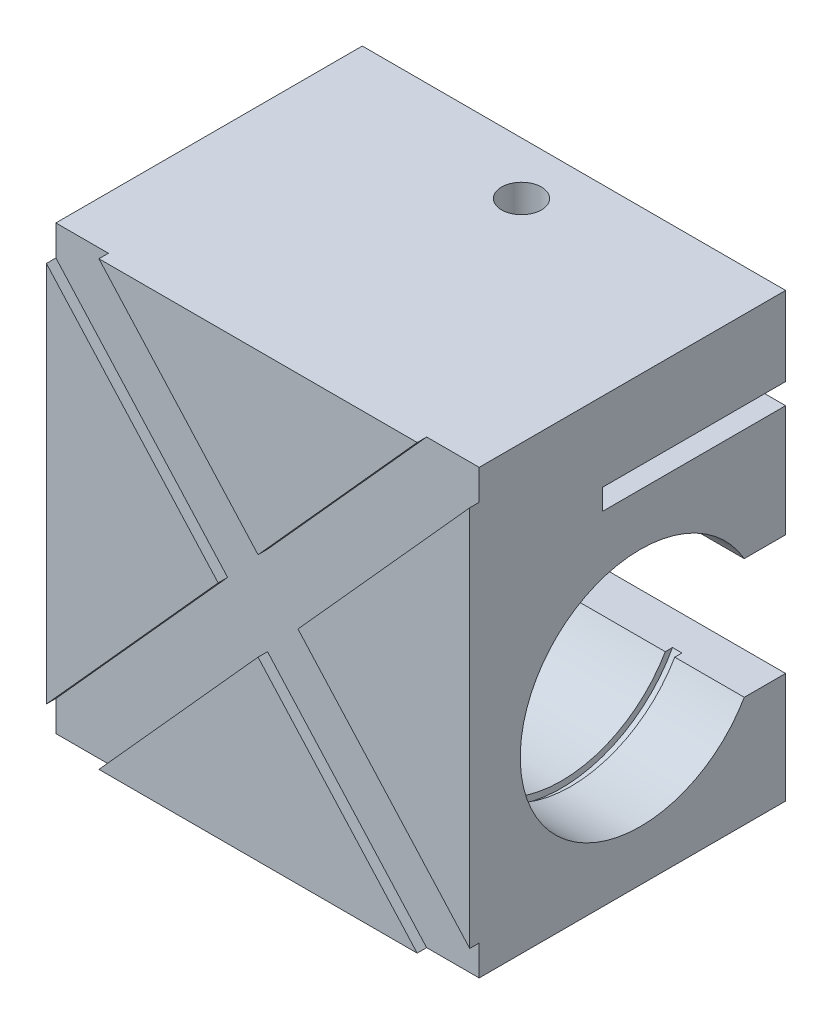
ISO-10303-21;
HEADER;
FILE_DESCRIPTION(('STEP AP214'),'2;1');
FILE_NAME('part.step','',(''),(''),'','','');
FILE_SCHEMA(('AUTOMOTIVE_DESIGN { 1 0 10303 214 1 1 1 1 }'));
ENDSEC;
DATA;
#1=APPLICATION_CONTEXT('core data for automotive mechanical design processes');
#2=APPLICATION_PROTOCOL_DEFINITION('international standard','automotive_design',2000,#1);
#3=PRODUCT_CONTEXT('',#1,'mechanical');
#4=PRODUCT('Part','Part','',(#3));
#5=PRODUCT_RELATED_PRODUCT_CATEGORY('part','',(#4));
#6=PRODUCT_DEFINITION_FORMATION('','',#4);
#7=PRODUCT_DEFINITION_CONTEXT('part definition',#1,'design');
#8=PRODUCT_DEFINITION('design','',#6,#7);
#9=PRODUCT_DEFINITION_SHAPE('','',#8);
#10=(LENGTH_UNIT() NAMED_UNIT(*) SI_UNIT(.MILLI.,.METRE.));
#11=(NAMED_UNIT(*) PLANE_ANGLE_UNIT() SI_UNIT($,.RADIAN.));
#12=(NAMED_UNIT(*) SI_UNIT($,.STERADIAN.) SOLID_ANGLE_UNIT());
#13=UNCERTAINTY_MEASURE_WITH_UNIT(LENGTH_MEASURE(1.E-05),#10,'distance_accuracy_value','');
#14=(GEOMETRIC_REPRESENTATION_CONTEXT(3) GLOBAL_UNCERTAINTY_ASSIGNED_CONTEXT((#13)) GLOBAL_UNIT_ASSIGNED_CONTEXT((#10,
#11,#12)) REPRESENTATION_CONTEXT('',''));
#15=CARTESIAN_POINT('',(0.,0.,0.));
#16=DIRECTION('',(0.,0.,1.));
#17=DIRECTION('',(1.,0.,0.));
#18=AXIS2_PLACEMENT_3D('',#15,#16,#17);
#19=CARTESIAN_POINT('',(-33.5,70.,25.));
#20=DIRECTION('',(0.,0.,-1.));
#21=DIRECTION('',(-1.,0.,0.));
#22=AXIS2_PLACEMENT_3D('',#19,#20,#21);
#23=PLANE('',#22);
#24=DIRECTION('',(0.,-1.,0.));
#25=VECTOR('',#24,1.);
#26=CARTESIAN_POINT('',(-33.5,70.,25.));
#27=LINE('',#26,#25);
#28=CARTESIAN_POINT('',(-33.5,65.2,25.));
#29=VERTEX_POINT('',#28);
#30=CARTESIAN_POINT('',(-33.5,4.8,25.));
#31=VERTEX_POINT('',#30);
#32=EDGE_CURVE('E398',#29,#31,#27,.T.);
#33=ORIENTED_EDGE('',*,*,#32,.T.);
#34=DIRECTION('',(-0.669003503005515,-0.743259250172071,0.));
#35=VECTOR('',#34,1.);
#36=CARTESIAN_POINT('',(-33.5,4.8,25.));
#37=LINE('',#36,#35);
#38=CARTESIAN_POINT('',(-6.31714854394455,35.,25.));
#39=VERTEX_POINT('',#38);
#40=EDGE_CURVE('E264',#39,#31,#37,.T.);
#41=ORIENTED_EDGE('',*,*,#40,.F.);
#42=DIRECTION('',(0.669003503005515,-0.743259250172071,0.));
#43=VECTOR('',#42,1.);
#44=CARTESIAN_POINT('',(-33.5,65.2,25.));
#45=LINE('',#44,#43);
#46=EDGE_CURVE('E472',#29,#39,#45,.T.);
#47=ORIENTED_EDGE('',*,*,#46,.F.);
#48=EDGE_LOOP('',(#33,#41,#47));
#49=FACE_BOUND('',#48,.T.);
#50=ADVANCED_FACE('F39',(#49),#23,.F.);
#51=DIRECTION('',(1.,0.,0.));
#52=VECTOR('',#51,1.);
#53=CARTESIAN_POINT('',(-33.5,70.,25.));
#54=LINE('',#53,#52);
#55=CARTESIAN_POINT('',(-25.1861561236694,70.,25.));
#56=VERTEX_POINT('',#55);
#57=CARTESIAN_POINT('',(25.1861561236694,70.,25.));
#58=VERTEX_POINT('',#57);
#59=EDGE_CURVE('E385',#56,#58,#54,.T.);
#60=ORIENTED_EDGE('',*,*,#59,.F.);
#61=DIRECTION('',(-0.669003503005515,0.743259250172071,0.));
#62=VECTOR('',#61,1.);
#63=CARTESIAN_POINT('',(-25.1861561236694,70.,25.));
#64=LINE('',#63,#62);
#65=CARTESIAN_POINT('',(0.,42.0183176454296,25.));
#66=VERTEX_POINT('',#65);
#67=EDGE_CURVE('E474',#66,#56,#64,.T.);
#68=ORIENTED_EDGE('',*,*,#67,.F.);
#69=DIRECTION('',(-0.669003503005515,-0.743259250172071,0.));
#70=VECTOR('',#69,1.);
#71=CARTESIAN_POINT('',(0.,42.0183176454296,25.));
#72=LINE('',#71,#70);
#73=EDGE_CURVE('E477',#58,#66,#72,.T.);
#74=ORIENTED_EDGE('',*,*,#73,.F.);
#75=EDGE_LOOP('',(#60,#68,#74));
#76=FACE_BOUND('',#75,.T.);
#77=ADVANCED_FACE('F521',(#76),#23,.F.);
#78=DIRECTION('',(0.,-1.,0.));
#79=VECTOR('',#78,1.);
#80=CARTESIAN_POINT('',(33.5,70.,25.));
#81=LINE('',#80,#79);
#82=CARTESIAN_POINT('',(33.5,65.1999999999996,25.));
#83=VERTEX_POINT('',#82);
#84=CARTESIAN_POINT('',(33.5,4.80000000000044,25.));
#85=VERTEX_POINT('',#84);
#86=EDGE_CURVE('E388',#83,#85,#81,.T.);
#87=ORIENTED_EDGE('',*,*,#86,.F.);
#88=DIRECTION('',(0.669003503006094,0.74325925017155,0.));
#89=VECTOR('',#88,1.);
#90=CARTESIAN_POINT('',(6.31714854391234,35.0000000000111,25.));
#91=LINE('',#90,#89);
#92=CARTESIAN_POINT('',(6.31714854391234,35.0000000000111,25.));
#93=VERTEX_POINT('',#92);
#94=EDGE_CURVE('E511',#93,#83,#91,.T.);
#95=ORIENTED_EDGE('',*,*,#94,.F.);
#96=DIRECTION('',(-0.669003503005822,0.743259250171795,0.));
#97=VECTOR('',#96,1.);
#98=CARTESIAN_POINT('',(6.31714854391234,35.0000000000111,25.));
#99=LINE('',#98,#97);
#100=EDGE_CURVE('E505',#85,#93,#99,.T.);
#101=ORIENTED_EDGE('',*,*,#100,.F.);
#102=EDGE_LOOP('',(#87,#95,#101));
#103=FACE_BOUND('',#102,.T.);
#104=ADVANCED_FACE('F580',(#103),#23,.F.);
#105=CARTESIAN_POINT('',(-90.1392090340252,27.,-1.99999999999999));
#106=DIRECTION('',(1.,0.,0.));
#107=DIRECTION('',(0.,0.,-1.));
#108=AXIS2_PLACEMENT_3D('',#105,#106,#107);
#109=CYLINDRICAL_SURFACE('',#108,19.);
#110=CARTESIAN_POINT('',(-22.5,27.,-1.99999999999999));
#111=DIRECTION('',(1.,0.,0.));
#112=DIRECTION('',(0.,0.,-1.));
#113=AXIS2_PLACEMENT_3D('',#110,#111,#112);
#114=CIRCLE('',#113,19.);
#115=CARTESIAN_POINT('',(-22.5,17.5,-18.4544826719043));
#116=VERTEX_POINT('',#115);
#117=CARTESIAN_POINT('',(-22.5,36.5,-18.4544826719043));
#118=VERTEX_POINT('',#117);
#119=EDGE_CURVE('E294',#116,#118,#114,.F.);
#120=ORIENTED_EDGE('',*,*,#119,.F.);
#121=DIRECTION('',(1.,0.,0.));
#122=VECTOR('',#121,1.);
#123=CARTESIAN_POINT('',(-90.1392090340252,17.5,-18.4544826719043));
#124=LINE('',#123,#122);
#125=CARTESIAN_POINT('',(-33.5,17.5,-18.4544826719043));
#126=VERTEX_POINT('',#125);
#127=EDGE_CURVE('E348',#126,#116,#124,.T.);
#128=ORIENTED_EDGE('',*,*,#127,.F.);
#129=CARTESIAN_POINT('',(-33.5,27.,-1.99999999999999));
#130=DIRECTION('',(1.,0.,0.));
#131=DIRECTION('',(0.,0.,-1.));
#132=AXIS2_PLACEMENT_3D('',#129,#130,#131);
#133=CIRCLE('',#132,19.);
#134=CARTESIAN_POINT('',(-33.5,36.5,-18.4544826719043));
#135=VERTEX_POINT('',#134);
#136=EDGE_CURVE('E322',#126,#135,#133,.F.);
#137=ORIENTED_EDGE('',*,*,#136,.T.);
#138=DIRECTION('',(1.,0.,0.));
#139=VECTOR('',#138,1.);
#140=CARTESIAN_POINT('',(-90.1392090340252,36.5,-18.4544826719043));
#141=LINE('',#140,#139);
#142=EDGE_CURVE('E343',#135,#118,#141,.T.);
#143=ORIENTED_EDGE('',*,*,#142,.T.);
#144=EDGE_LOOP('',(#120,#128,#137,#143));
#145=FACE_BOUND('',#144,.T.);
#146=ADVANCED_FACE('F438',(#145),#109,.F.);
#147=CARTESIAN_POINT('',(-90.1392090340252,17.5,-25.));
#148=DIRECTION('',(0.,1.,0.));
#149=DIRECTION('',(0.,0.,1.));
#150=AXIS2_PLACEMENT_3D('',#147,#148,#149);
#151=PLANE('',#150);
#152=ORIENTED_EDGE('',*,*,#127,.T.);
#153=DIRECTION('',(0.,0.,-1.));
#154=VECTOR('',#153,1.);
#155=CARTESIAN_POINT('',(-22.5,17.5,-25.));
#156=LINE('',#155,#154);
#157=CARTESIAN_POINT('',(-22.5,17.5,-19.599715906798));
#158=VERTEX_POINT('',#157);
#159=EDGE_CURVE('E296',#116,#158,#156,.T.);
#160=ORIENTED_EDGE('',*,*,#159,.T.);
#161=DIRECTION('',(1.,0.,0.));
#162=VECTOR('',#161,1.);
#163=CARTESIAN_POINT('',(-22.5,17.5,-19.599715906798));
#164=LINE('',#163,#162);
#165=CARTESIAN_POINT('',(-21.,17.5,-19.599715906798));
#166=VERTEX_POINT('',#165);
#167=EDGE_CURVE('E299',#166,#158,#164,.F.);
#168=ORIENTED_EDGE('',*,*,#167,.F.);
#169=DIRECTION('',(0.,0.,-1.));
#170=VECTOR('',#169,1.);
#171=CARTESIAN_POINT('',(-21.,17.5,-25.));
#172=LINE('',#171,#170);
#173=CARTESIAN_POINT('',(-21.,17.5,-18.4544826719043));
#174=VERTEX_POINT('',#173);
#175=EDGE_CURVE('E292',#174,#166,#172,.T.);
#176=ORIENTED_EDGE('',*,*,#175,.F.);
#177=CARTESIAN_POINT('',(21.,17.5,-18.4544826719043));
#178=VERTEX_POINT('',#177);
#179=EDGE_CURVE('E351',#174,#178,#124,.T.);
#180=ORIENTED_EDGE('',*,*,#179,.T.);
#181=DIRECTION('',(0.,0.,-1.));
#182=VECTOR('',#181,1.);
#183=CARTESIAN_POINT('',(21.,17.5,-25.));
#184=LINE('',#183,#182);
#185=CARTESIAN_POINT('',(21.,17.5,-19.599715906798));
#186=VERTEX_POINT('',#185);
#187=EDGE_CURVE('E310',#178,#186,#184,.T.);
#188=ORIENTED_EDGE('',*,*,#187,.T.);
#189=DIRECTION('',(-1.,0.,0.));
#190=VECTOR('',#189,1.);
#191=CARTESIAN_POINT('',(22.5,17.5,-19.599715906798));
#192=LINE('',#191,#190);
#193=CARTESIAN_POINT('',(22.5,17.5,-19.599715906798));
#194=VERTEX_POINT('',#193);
#195=EDGE_CURVE('E318',#186,#194,#192,.F.);
#196=ORIENTED_EDGE('',*,*,#195,.T.);
#197=DIRECTION('',(0.,0.,-1.));
#198=VECTOR('',#197,1.);
#199=CARTESIAN_POINT('',(22.5,17.5,-25.));
#200=LINE('',#199,#198);
#201=CARTESIAN_POINT('',(22.5,17.5,-18.4544826719043));
#202=VERTEX_POINT('',#201);
#203=EDGE_CURVE('E316',#202,#194,#200,.T.);
#204=ORIENTED_EDGE('',*,*,#203,.F.);
#205=CARTESIAN_POINT('',(33.5,17.5,-18.4544826719043));
#206=VERTEX_POINT('',#205);
#207=EDGE_CURVE('E346',#202,#206,#124,.T.);
#208=ORIENTED_EDGE('',*,*,#207,.T.);
#209=DIRECTION('',(0.,0.,1.));
#210=VECTOR('',#209,1.);
#211=CARTESIAN_POINT('',(33.5,17.5,-25.));
#212=LINE('',#211,#210);
#213=CARTESIAN_POINT('',(33.5,17.5,-25.));
#214=VERTEX_POINT('',#213);
#215=EDGE_CURVE('E330',#214,#206,#212,.T.);
#216=ORIENTED_EDGE('',*,*,#215,.F.);
#217=DIRECTION('',(1.,0.,0.));
#218=VECTOR('',#217,1.);
#219=CARTESIAN_POINT('',(-90.1392090340252,17.5,-25.));
#220=LINE('',#219,#218);
#221=CARTESIAN_POINT('',(-33.5,17.5,-25.));
#222=VERTEX_POINT('',#221);
#223=EDGE_CURVE('E326',#222,#214,#220,.T.);
#224=ORIENTED_EDGE('',*,*,#223,.F.);
#225=DIRECTION('',(0.,0.,-1.));
#226=VECTOR('',#225,1.);
#227=CARTESIAN_POINT('',(-33.5,17.5,-25.));
#228=LINE('',#227,#226);
#229=EDGE_CURVE('E325',#126,#222,#228,.T.);
#230=ORIENTED_EDGE('',*,*,#229,.F.);
#231=EDGE_LOOP('',(#152,#160,#168,#176,#180,#188,#196,#204,#208,#216,#224,#230));
#232=FACE_BOUND('',#231,.T.);
#233=ADVANCED_FACE('F433',(#232),#151,.T.);
#234=CARTESIAN_POINT('',(-90.1392090340252,36.5,-25.));
#235=DIRECTION('',(0.,1.,0.));
#236=DIRECTION('',(0.,0.,1.));
#237=AXIS2_PLACEMENT_3D('',#234,#235,#236);
#238=PLANE('',#237);
#239=DIRECTION('',(0.,0.,-1.));
#240=VECTOR('',#239,1.);
#241=CARTESIAN_POINT('',(-22.5,36.5,-25.));
#242=LINE('',#241,#240);
#243=CARTESIAN_POINT('',(-22.5,36.5,-19.599715906798));
#244=VERTEX_POINT('',#243);
#245=EDGE_CURVE('E11',#118,#244,#242,.T.);
#246=ORIENTED_EDGE('',*,*,#245,.F.);
#247=ORIENTED_EDGE('',*,*,#142,.F.);
#248=DIRECTION('',(0.,0.,-1.));
#249=VECTOR('',#248,1.);
#250=CARTESIAN_POINT('',(-33.5,36.5,-25.));
#251=LINE('',#250,#249);
#252=CARTESIAN_POINT('',(-33.5,36.5,-25.));
#253=VERTEX_POINT('',#252);
#254=EDGE_CURVE('E329',#135,#253,#251,.T.);
#255=ORIENTED_EDGE('',*,*,#254,.T.);
#256=DIRECTION('',(1.,0.,0.));
#257=VECTOR('',#256,1.);
#258=CARTESIAN_POINT('',(-90.1392090340252,36.5,-25.));
#259=LINE('',#258,#257);
#260=CARTESIAN_POINT('',(33.5,36.5,-25.));
#261=VERTEX_POINT('',#260);
#262=EDGE_CURVE('E340',#253,#261,#259,.T.);
#263=ORIENTED_EDGE('',*,*,#262,.T.);
#264=DIRECTION('',(0.,0.,1.));
#265=VECTOR('',#264,1.);
#266=CARTESIAN_POINT('',(33.5,36.5,-25.));
#267=LINE('',#266,#265);
#268=CARTESIAN_POINT('',(33.5,36.5,-18.4544826719043));
#269=VERTEX_POINT('',#268);
#270=EDGE_CURVE('E337',#261,#269,#267,.T.);
#271=ORIENTED_EDGE('',*,*,#270,.T.);
#272=CARTESIAN_POINT('',(22.5,36.5,-18.4544826719043));
#273=VERTEX_POINT('',#272);
#274=EDGE_CURVE('E342',#273,#269,#141,.T.);
#275=ORIENTED_EDGE('',*,*,#274,.F.);
#276=DIRECTION('',(0.,0.,-1.));
#277=VECTOR('',#276,1.);
#278=CARTESIAN_POINT('',(22.5,36.5,-25.));
#279=LINE('',#278,#277);
#280=CARTESIAN_POINT('',(22.5,36.5,-19.599715906798));
#281=VERTEX_POINT('',#280);
#282=EDGE_CURVE('E415',#273,#281,#279,.T.);
#283=ORIENTED_EDGE('',*,*,#282,.T.);
#284=DIRECTION('',(-1.,0.,0.));
#285=VECTOR('',#284,1.);
#286=CARTESIAN_POINT('',(22.5,36.5,-19.599715906798));
#287=LINE('',#286,#285);
#288=CARTESIAN_POINT('',(21.,36.5,-19.599715906798));
#289=VERTEX_POINT('',#288);
#290=EDGE_CURVE('E413',#289,#281,#287,.F.);
#291=ORIENTED_EDGE('',*,*,#290,.F.);
#292=DIRECTION('',(0.,0.,-1.));
#293=VECTOR('',#292,1.);
#294=CARTESIAN_POINT('',(21.,36.5,-25.));
#295=LINE('',#294,#293);
#296=CARTESIAN_POINT('',(21.,36.5,-18.4544826719043));
#297=VERTEX_POINT('',#296);
#298=EDGE_CURVE('E410',#297,#289,#295,.T.);
#299=ORIENTED_EDGE('',*,*,#298,.F.);
#300=CARTESIAN_POINT('',(-21.,36.5,-18.4544826719043));
#301=VERTEX_POINT('',#300);
#302=EDGE_CURVE('E347',#301,#297,#141,.T.);
#303=ORIENTED_EDGE('',*,*,#302,.F.);
#304=DIRECTION('',(0.,0.,-1.));
#305=VECTOR('',#304,1.);
#306=CARTESIAN_POINT('',(-21.,36.5,-25.));
#307=LINE('',#306,#305);
#308=CARTESIAN_POINT('',(-21.,36.5,-19.599715906798));
#309=VERTEX_POINT('',#308);
#310=EDGE_CURVE('E418',#301,#309,#307,.T.);
#311=ORIENTED_EDGE('',*,*,#310,.T.);
#312=DIRECTION('',(1.,0.,0.));
#313=VECTOR('',#312,1.);
#314=CARTESIAN_POINT('',(-22.5,36.5,-19.599715906798));
#315=LINE('',#314,#313);
#316=EDGE_CURVE('E47',#309,#244,#315,.F.);
#317=ORIENTED_EDGE('',*,*,#316,.T.);
#318=EDGE_LOOP('',(#246,#247,#255,#263,#271,#275,#283,#291,#299,#303,#311,#317));
#319=FACE_BOUND('',#318,.T.);
#320=ADVANCED_FACE('F423',(#319),#238,.F.);
#321=ORIENTED_EDGE('',*,*,#179,.F.);
#322=CARTESIAN_POINT('',(-21.,27.,-1.99999999999999));
#323=DIRECTION('',(1.,0.,0.));
#324=DIRECTION('',(0.,0.,-1.));
#325=AXIS2_PLACEMENT_3D('',#322,#323,#324);
#326=CIRCLE('',#325,19.);
#327=EDGE_CURVE('E288',#174,#301,#326,.F.);
#328=ORIENTED_EDGE('',*,*,#327,.T.);
#329=ORIENTED_EDGE('',*,*,#302,.T.);
#330=CARTESIAN_POINT('',(21.,27.,-1.99999999999999));
#331=DIRECTION('',(1.,0.,0.));
#332=DIRECTION('',(0.,0.,-1.));
#333=AXIS2_PLACEMENT_3D('',#330,#331,#332);
#334=CIRCLE('',#333,19.);
#335=EDGE_CURVE('E305',#178,#297,#334,.F.);
#336=ORIENTED_EDGE('',*,*,#335,.F.);
#337=EDGE_LOOP('',(#321,#328,#329,#336));
#338=FACE_BOUND('',#337,.T.);
#339=ADVANCED_FACE('F596',(#338),#109,.F.);
#340=CARTESIAN_POINT('',(33.5,70.,-25.));
#341=DIRECTION('',(-1.,0.,0.));
#342=DIRECTION('',(0.,0.,1.));
#343=AXIS2_PLACEMENT_3D('',#340,#341,#342);
#344=PLANE('',#343);
#345=ORIENTED_EDGE('',*,*,#86,.T.);
#346=DIRECTION('',(0.,0.,1.));
#347=VECTOR('',#346,1.);
#348=CARTESIAN_POINT('',(33.5,4.80000000000044,23.5));
#349=LINE('',#348,#347);
#350=CARTESIAN_POINT('',(33.5,4.80000000000044,23.5));
#351=VERTEX_POINT('',#350);
#352=EDGE_CURVE('E496',#351,#85,#349,.T.);
#353=ORIENTED_EDGE('',*,*,#352,.F.);
#354=DIRECTION('',(0.,1.,0.));
#355=VECTOR('',#354,1.);
#356=CARTESIAN_POINT('',(33.5,4.44089209850063E-13,23.5));
#357=LINE('',#356,#355);
#358=CARTESIAN_POINT('',(33.5,4.44089209850063E-13,23.5));
#359=VERTEX_POINT('',#358);
#360=EDGE_CURVE('E618',#359,#351,#357,.T.);
#361=ORIENTED_EDGE('',*,*,#360,.F.);
#362=DIRECTION('',(0.,0.,-1.));
#363=VECTOR('',#362,1.);
#364=CARTESIAN_POINT('',(33.5,0.,-25.));
#365=LINE('',#364,#363);
#366=CARTESIAN_POINT('',(33.5,0.,-25.));
#367=VERTEX_POINT('',#366);
#368=EDGE_CURVE('E355',#359,#367,#365,.T.);
#369=ORIENTED_EDGE('',*,*,#368,.T.);
#370=DIRECTION('',(0.,-1.,0.));
#371=VECTOR('',#370,1.);
#372=CARTESIAN_POINT('',(33.5,70.,-25.));
#373=LINE('',#372,#371);
#374=EDGE_CURVE('E405',#214,#367,#373,.T.);
#375=ORIENTED_EDGE('',*,*,#374,.F.);
#376=ORIENTED_EDGE('',*,*,#215,.T.);
#377=CARTESIAN_POINT('',(33.5,27.,-1.99999999999999));
#378=DIRECTION('',(1.,0.,0.));
#379=DIRECTION('',(0.,0.,-1.));
#380=AXIS2_PLACEMENT_3D('',#377,#378,#379);
#381=CIRCLE('',#380,19.);
#382=EDGE_CURVE('E333',#269,#206,#381,.T.);
#383=ORIENTED_EDGE('',*,*,#382,.F.);
#384=ORIENTED_EDGE('',*,*,#270,.F.);
#385=CARTESIAN_POINT('',(33.5,54.2,-25.));
#386=VERTEX_POINT('',#385);
#387=EDGE_CURVE('E411',#386,#261,#373,.T.);
#388=ORIENTED_EDGE('',*,*,#387,.F.);
#389=DIRECTION('',(0.,0.,-1.));
#390=VECTOR('',#389,1.);
#391=CARTESIAN_POINT('',(33.5,54.2,4.));
#392=LINE('',#391,#390);
#393=CARTESIAN_POINT('',(33.5,54.2,4.));
#394=VERTEX_POINT('',#393);
#395=EDGE_CURVE('E334',#394,#386,#392,.T.);
#396=ORIENTED_EDGE('',*,*,#395,.F.);
#397=DIRECTION('',(0.,-1.,0.));
#398=VECTOR('',#397,1.);
#399=CARTESIAN_POINT('',(33.5,57.5,4.));
#400=LINE('',#399,#398);
#401=CARTESIAN_POINT('',(33.5,57.5,4.));
#402=VERTEX_POINT('',#401);
#403=EDGE_CURVE('E359',#402,#394,#400,.T.);
#404=ORIENTED_EDGE('',*,*,#403,.F.);
#405=DIRECTION('',(0.,0.,1.));
#406=VECTOR('',#405,1.);
#407=CARTESIAN_POINT('',(33.5,57.5,-25.));
#408=LINE('',#407,#406);
#409=CARTESIAN_POINT('',(33.5,57.5,-25.));
#410=VERTEX_POINT('',#409);
#411=EDGE_CURVE('E369',#410,#402,#408,.T.);
#412=ORIENTED_EDGE('',*,*,#411,.F.);
#413=CARTESIAN_POINT('',(33.5,70.,-25.));
#414=VERTEX_POINT('',#413);
#415=EDGE_CURVE('E407',#414,#410,#373,.T.);
#416=ORIENTED_EDGE('',*,*,#415,.F.);
#417=DIRECTION('',(0.,0.,-1.));
#418=VECTOR('',#417,1.);
#419=CARTESIAN_POINT('',(33.5,70.,-25.));
#420=LINE('',#419,#418);
#421=CARTESIAN_POINT('',(33.5,69.9999999999996,23.5));
#422=VERTEX_POINT('',#421);
#423=EDGE_CURVE('E378',#422,#414,#420,.T.);
#424=ORIENTED_EDGE('',*,*,#423,.F.);
#425=DIRECTION('',(0.,1.,0.));
#426=VECTOR('',#425,1.);
#427=CARTESIAN_POINT('',(33.5,69.9999999999996,23.5));
#428=LINE('',#427,#426);
#429=CARTESIAN_POINT('',(33.5,65.1999999999996,23.5));
#430=VERTEX_POINT('',#429);
#431=EDGE_CURVE('E604',#430,#422,#428,.T.);
#432=ORIENTED_EDGE('',*,*,#431,.F.);
#433=DIRECTION('',(0.,0.,1.));
#434=VECTOR('',#433,1.);
#435=CARTESIAN_POINT('',(33.5,65.1999999999996,23.5));
#436=LINE('',#435,#434);
#437=EDGE_CURVE('E491',#430,#83,#436,.T.);
#438=ORIENTED_EDGE('',*,*,#437,.T.);
#439=EDGE_LOOP('',(#345,#353,#361,#369,#375,#376,#383,#384,#388,#396,#404,#412,#416,#424,#432,#438));
#440=FACE_BOUND('',#439,.T.);
#441=ADVANCED_FACE('F41',(#440),#344,.F.);
#442=CARTESIAN_POINT('',(-33.5,70.,-25.));
#443=DIRECTION('',(0.,0.,1.));
#444=DIRECTION('',(1.,0.,0.));
#445=AXIS2_PLACEMENT_3D('',#442,#443,#444);
#446=PLANE('',#445);
#447=ORIENTED_EDGE('',*,*,#223,.T.);
#448=ORIENTED_EDGE('',*,*,#374,.T.);
#449=DIRECTION('',(-1.,0.,0.));
#450=VECTOR('',#449,1.);
#451=CARTESIAN_POINT('',(-33.5,0.,-25.));
#452=LINE('',#451,#450);
#453=CARTESIAN_POINT('',(-33.5,0.,-25.));
#454=VERTEX_POINT('',#453);
#455=EDGE_CURVE('E390',#367,#454,#452,.T.);
#456=ORIENTED_EDGE('',*,*,#455,.T.);
#457=DIRECTION('',(0.,-1.,0.));
#458=VECTOR('',#457,1.);
#459=CARTESIAN_POINT('',(-33.5,70.,-25.));
#460=LINE('',#459,#458);
#461=EDGE_CURVE('E401',#222,#454,#460,.T.);
#462=ORIENTED_EDGE('',*,*,#461,.F.);
#463=EDGE_LOOP('',(#447,#448,#456,#462));
#464=FACE_BOUND('',#463,.T.);
#465=ADVANCED_FACE('F459',(#464),#446,.F.);
#466=ORIENTED_EDGE('',*,*,#387,.T.);
#467=ORIENTED_EDGE('',*,*,#262,.F.);
#468=CARTESIAN_POINT('',(-33.5,54.2,-25.));
#469=VERTEX_POINT('',#468);
#470=EDGE_CURVE('E406',#469,#253,#460,.T.);
#471=ORIENTED_EDGE('',*,*,#470,.F.);
#472=DIRECTION('',(1.,0.,0.));
#473=VECTOR('',#472,1.);
#474=CARTESIAN_POINT('',(-90.1392090340252,54.2,-25.));
#475=LINE('',#474,#473);
#476=EDGE_CURVE('E356',#469,#386,#475,.T.);
#477=ORIENTED_EDGE('',*,*,#476,.T.);
#478=EDGE_LOOP('',(#466,#467,#471,#477));
#479=FACE_BOUND('',#478,.T.);
#480=ADVANCED_FACE('F451',(#479),#446,.F.);
#481=CARTESIAN_POINT('',(-33.5,70.,-25.));
#482=DIRECTION('',(1.,0.,0.));
#483=DIRECTION('',(0.,0.,-1.));
#484=AXIS2_PLACEMENT_3D('',#481,#482,#483);
#485=PLANE('',#484);
#486=ORIENTED_EDGE('',*,*,#32,.F.);
#487=DIRECTION('',(0.,0.,1.));
#488=VECTOR('',#487,1.);
#489=CARTESIAN_POINT('',(-33.5,65.2,23.5));
#490=LINE('',#489,#488);
#491=CARTESIAN_POINT('',(-33.5,65.2,23.5));
#492=VERTEX_POINT('',#491);
#493=EDGE_CURVE('E482',#492,#29,#490,.T.);
#494=ORIENTED_EDGE('',*,*,#493,.F.);
#495=DIRECTION('',(0.,-1.,0.));
#496=VECTOR('',#495,1.);
#497=CARTESIAN_POINT('',(-33.5,70.,23.5));
#498=LINE('',#497,#496);
#499=CARTESIAN_POINT('',(-33.5,70.,23.5));
#500=VERTEX_POINT('',#499);
#501=EDGE_CURVE('E533',#500,#492,#498,.T.);
#502=ORIENTED_EDGE('',*,*,#501,.F.);
#503=DIRECTION('',(0.,0.,1.));
#504=VECTOR('',#503,1.);
#505=CARTESIAN_POINT('',(-33.5,70.,-25.));
#506=LINE('',#505,#504);
#507=CARTESIAN_POINT('',(-33.5,70.,-25.));
#508=VERTEX_POINT('',#507);
#509=EDGE_CURVE('E382',#508,#500,#506,.T.);
#510=ORIENTED_EDGE('',*,*,#509,.F.);
#511=CARTESIAN_POINT('',(-33.5,57.5,-25.));
#512=VERTEX_POINT('',#511);
#513=EDGE_CURVE('E402',#508,#512,#460,.T.);
#514=ORIENTED_EDGE('',*,*,#513,.T.);
#515=DIRECTION('',(0.,0.,-1.));
#516=VECTOR('',#515,1.);
#517=CARTESIAN_POINT('',(-33.5,57.5,-25.));
#518=LINE('',#517,#516);
#519=CARTESIAN_POINT('',(-33.5,57.5,4.));
#520=VERTEX_POINT('',#519);
#521=EDGE_CURVE('E366',#520,#512,#518,.T.);
#522=ORIENTED_EDGE('',*,*,#521,.F.);
#523=DIRECTION('',(0.,1.,0.));
#524=VECTOR('',#523,1.);
#525=CARTESIAN_POINT('',(-33.5,57.5,4.));
#526=LINE('',#525,#524);
#527=CARTESIAN_POINT('',(-33.5,54.2,4.));
#528=VERTEX_POINT('',#527);
#529=EDGE_CURVE('E374',#528,#520,#526,.T.);
#530=ORIENTED_EDGE('',*,*,#529,.F.);
#531=DIRECTION('',(0.,0.,1.));
#532=VECTOR('',#531,1.);
#533=CARTESIAN_POINT('',(-33.5,54.2,4.));
#534=LINE('',#533,#532);
#535=EDGE_CURVE('E321',#469,#528,#534,.T.);
#536=ORIENTED_EDGE('',*,*,#535,.F.);
#537=ORIENTED_EDGE('',*,*,#470,.T.);
#538=ORIENTED_EDGE('',*,*,#254,.F.);
#539=ORIENTED_EDGE('',*,*,#136,.F.);
#540=ORIENTED_EDGE('',*,*,#229,.T.);
#541=ORIENTED_EDGE('',*,*,#461,.T.);
#542=DIRECTION('',(0.,0.,1.));
#543=VECTOR('',#542,1.);
#544=CARTESIAN_POINT('',(-33.5,0.,-25.));
#545=LINE('',#544,#543);
#546=CARTESIAN_POINT('',(-33.5,0.,23.5));
#547=VERTEX_POINT('',#546);
#548=EDGE_CURVE('E393',#454,#547,#545,.T.);
#549=ORIENTED_EDGE('',*,*,#548,.T.);
#550=DIRECTION('',(0.,-1.,0.));
#551=VECTOR('',#550,1.);
#552=CARTESIAN_POINT('',(-33.5,0.,23.5));
#553=LINE('',#552,#551);
#554=CARTESIAN_POINT('',(-33.5,4.8,23.5));
#555=VERTEX_POINT('',#554);
#556=EDGE_CURVE('E260',#555,#547,#553,.T.);
#557=ORIENTED_EDGE('',*,*,#556,.F.);
#558=DIRECTION('',(0.,0.,1.));
#559=VECTOR('',#558,1.);
#560=CARTESIAN_POINT('',(-33.5,4.8,23.5));
#561=LINE('',#560,#559);
#562=EDGE_CURVE('E282',#555,#31,#561,.T.);
#563=ORIENTED_EDGE('',*,*,#562,.T.);
#564=EDGE_LOOP('',(#486,#494,#502,#510,#514,#522,#530,#536,#537,#538,#539,#540,#541,#549,#557,#563));
#565=FACE_BOUND('',#564,.T.);
#566=ADVANCED_FACE('F442',(#565),#485,.F.);
#567=ORIENTED_EDGE('',*,*,#415,.T.);
#568=DIRECTION('',(1.,0.,0.));
#569=VECTOR('',#568,1.);
#570=CARTESIAN_POINT('',(-90.1392090340252,57.5,-25.));
#571=LINE('',#570,#569);
#572=EDGE_CURVE('E360',#512,#410,#571,.T.);
#573=ORIENTED_EDGE('',*,*,#572,.F.);
#574=ORIENTED_EDGE('',*,*,#513,.F.);
#575=DIRECTION('',(-1.,0.,0.));
#576=VECTOR('',#575,1.);
#577=CARTESIAN_POINT('',(-33.5,70.,-25.));
#578=LINE('',#577,#576);
#579=EDGE_CURVE('E380',#414,#508,#578,.T.);
#580=ORIENTED_EDGE('',*,*,#579,.F.);
#581=EDGE_LOOP('',(#567,#573,#574,#580));
#582=FACE_BOUND('',#581,.T.);
#583=ADVANCED_FACE('F551',(#582),#446,.F.);
#584=DIRECTION('',(1.,0.,0.));
#585=VECTOR('',#584,1.);
#586=CARTESIAN_POINT('',(-33.5,0.,25.));
#587=LINE('',#586,#585);
#588=CARTESIAN_POINT('',(-25.1861561236694,0.,25.));
#589=VERTEX_POINT('',#588);
#590=CARTESIAN_POINT('',(25.1861561236694,0.,25.));
#591=VERTEX_POINT('',#590);
#592=EDGE_CURVE('E270',#589,#591,#587,.T.);
#593=ORIENTED_EDGE('',*,*,#592,.T.);
#594=DIRECTION('',(0.669003503005515,-0.743259250172071,0.));
#595=VECTOR('',#594,1.);
#596=CARTESIAN_POINT('',(0.,27.9816823545704,25.));
#597=LINE('',#596,#595);
#598=CARTESIAN_POINT('',(0.,27.9816823545704,25.));
#599=VERTEX_POINT('',#598);
#600=EDGE_CURVE('E502',#599,#591,#597,.T.);
#601=ORIENTED_EDGE('',*,*,#600,.F.);
#602=DIRECTION('',(0.669003503005515,0.743259250172071,0.));
#603=VECTOR('',#602,1.);
#604=CARTESIAN_POINT('',(-25.1861561236694,0.,25.));
#605=LINE('',#604,#603);
#606=EDGE_CURVE('E503',#589,#599,#605,.T.);
#607=ORIENTED_EDGE('',*,*,#606,.F.);
#608=EDGE_LOOP('',(#593,#601,#607));
#609=FACE_BOUND('',#608,.T.);
#610=ADVANCED_FACE('F501',(#609),#23,.F.);
#611=CARTESIAN_POINT('',(0.,70.,0.));
#612=DIRECTION('',(0.,1.,0.));
#613=DIRECTION('',(0.,0.,1.));
#614=AXIS2_PLACEMENT_3D('',#611,#612,#613);
#615=PLANE('',#614);
#616=DIRECTION('',(0.,0.,1.));
#617=VECTOR('',#616,1.);
#618=CARTESIAN_POINT('',(-25.1861561236694,70.,23.5));
#619=LINE('',#618,#617);
#620=CARTESIAN_POINT('',(-25.1861561236694,70.,23.5));
#621=VERTEX_POINT('',#620);
#622=EDGE_CURVE('E484',#621,#56,#619,.T.);
#623=ORIENTED_EDGE('',*,*,#622,.T.);
#624=ORIENTED_EDGE('',*,*,#59,.T.);
#625=DIRECTION('',(0.,0.,1.));
#626=VECTOR('',#625,1.);
#627=CARTESIAN_POINT('',(25.1861561236694,70.,23.5));
#628=LINE('',#627,#626);
#629=CARTESIAN_POINT('',(25.1861561236694,70.,23.5));
#630=VERTEX_POINT('',#629);
#631=EDGE_CURVE('E489',#630,#58,#628,.T.);
#632=ORIENTED_EDGE('',*,*,#631,.F.);
#633=DIRECTION('',(-1.,0.,0.));
#634=VECTOR('',#633,1.);
#635=CARTESIAN_POINT('',(33.5,69.9999999999996,23.5));
#636=LINE('',#635,#634);
#637=EDGE_CURVE('E616',#422,#630,#636,.T.);
#638=ORIENTED_EDGE('',*,*,#637,.F.);
#639=ORIENTED_EDGE('',*,*,#423,.T.);
#640=ORIENTED_EDGE('',*,*,#579,.T.);
#641=ORIENTED_EDGE('',*,*,#509,.T.);
#642=DIRECTION('',(-1.,0.,0.));
#643=VECTOR('',#642,1.);
#644=CARTESIAN_POINT('',(-33.5,70.,23.5));
#645=LINE('',#644,#643);
#646=EDGE_CURVE('E529',#621,#500,#645,.T.);
#647=ORIENTED_EDGE('',*,*,#646,.F.);
#648=EDGE_LOOP('',(#623,#624,#632,#638,#639,#640,#641,#647));
#649=FACE_BOUND('',#648,.T.);
#650=CARTESIAN_POINT('',(0.,70.,-16.7));
#651=DIRECTION('',(0.,1.,0.));
#652=DIRECTION('',(0.,0.,1.));
#653=AXIS2_PLACEMENT_3D('',#650,#651,#652);
#654=CIRCLE('',#653,3.15);
#655=CARTESIAN_POINT('',(0.,70.,-13.55));
#656=VERTEX_POINT('',#655);
#657=EDGE_CURVE('E278',#656,#656,#654,.T.);
#658=ORIENTED_EDGE('',*,*,#657,.F.);
#659=EDGE_LOOP('',(#658));
#660=FACE_BOUND('',#659,.T.);
#661=ADVANCED_FACE('F527',(#649,#660),#615,.T.);
#662=CARTESIAN_POINT('',(0.,0.,0.));
#663=DIRECTION('',(0.,1.,0.));
#664=DIRECTION('',(0.,0.,1.));
#665=AXIS2_PLACEMENT_3D('',#662,#663,#664);
#666=PLANE('',#665);
#667=ORIENTED_EDGE('',*,*,#592,.F.);
#668=DIRECTION('',(0.,0.,1.));
#669=VECTOR('',#668,1.);
#670=CARTESIAN_POINT('',(-25.1861561236694,0.,23.5));
#671=LINE('',#670,#669);
#672=CARTESIAN_POINT('',(-25.1861561236694,0.,23.5));
#673=VERTEX_POINT('',#672);
#674=EDGE_CURVE('E251',#673,#589,#671,.T.);
#675=ORIENTED_EDGE('',*,*,#674,.F.);
#676=DIRECTION('',(1.,0.,0.));
#677=VECTOR('',#676,1.);
#678=CARTESIAN_POINT('',(-33.5,0.,23.5));
#679=LINE('',#678,#677);
#680=EDGE_CURVE('E254',#547,#673,#679,.T.);
#681=ORIENTED_EDGE('',*,*,#680,.F.);
#682=ORIENTED_EDGE('',*,*,#548,.F.);
#683=ORIENTED_EDGE('',*,*,#455,.F.);
#684=ORIENTED_EDGE('',*,*,#368,.F.);
#685=DIRECTION('',(1.,0.,0.));
#686=VECTOR('',#685,1.);
#687=CARTESIAN_POINT('',(33.5,4.44089209850063E-13,23.5));
#688=LINE('',#687,#686);
#689=CARTESIAN_POINT('',(25.1861561236694,0.,23.5));
#690=VERTEX_POINT('',#689);
#691=EDGE_CURVE('E497',#690,#359,#688,.T.);
#692=ORIENTED_EDGE('',*,*,#691,.F.);
#693=DIRECTION('',(0.,0.,1.));
#694=VECTOR('',#693,1.);
#695=CARTESIAN_POINT('',(25.1861561236694,0.,23.5));
#696=LINE('',#695,#694);
#697=EDGE_CURVE('E272',#690,#591,#696,.T.);
#698=ORIENTED_EDGE('',*,*,#697,.T.);
#699=EDGE_LOOP('',(#667,#675,#681,#682,#683,#684,#692,#698));
#700=FACE_BOUND('',#699,.T.);
#701=ADVANCED_FACE('F267',(#700),#666,.F.);
#702=CARTESIAN_POINT('',(-90.1392090340252,54.2,4.));
#703=DIRECTION('',(0.,-1.,0.));
#704=DIRECTION('',(0.,0.,-1.));
#705=AXIS2_PLACEMENT_3D('',#702,#703,#704);
#706=PLANE('',#705);
#707=ORIENTED_EDGE('',*,*,#535,.T.);
#708=DIRECTION('',(1.,0.,0.));
#709=VECTOR('',#708,1.);
#710=CARTESIAN_POINT('',(-90.1392090340252,54.2,4.));
#711=LINE('',#710,#709);
#712=EDGE_CURVE('E364',#528,#394,#711,.T.);
#713=ORIENTED_EDGE('',*,*,#712,.T.);
#714=ORIENTED_EDGE('',*,*,#395,.T.);
#715=ORIENTED_EDGE('',*,*,#476,.F.);
#716=EDGE_LOOP('',(#707,#713,#714,#715));
#717=FACE_BOUND('',#716,.T.);
#718=ADVANCED_FACE('F562',(#717),#706,.F.);
#719=CARTESIAN_POINT('',(-90.1392090340252,57.5,4.));
#720=DIRECTION('',(0.,0.,1.));
#721=DIRECTION('',(1.,0.,0.));
#722=AXIS2_PLACEMENT_3D('',#719,#720,#721);
#723=PLANE('',#722);
#724=ORIENTED_EDGE('',*,*,#529,.T.);
#725=DIRECTION('',(1.,0.,0.));
#726=VECTOR('',#725,1.);
#727=CARTESIAN_POINT('',(-90.1392090340252,57.5,4.));
#728=LINE('',#727,#726);
#729=EDGE_CURVE('E362',#520,#402,#728,.T.);
#730=ORIENTED_EDGE('',*,*,#729,.T.);
#731=ORIENTED_EDGE('',*,*,#403,.T.);
#732=ORIENTED_EDGE('',*,*,#712,.F.);
#733=EDGE_LOOP('',(#724,#730,#731,#732));
#734=FACE_BOUND('',#733,.T.);
#735=ADVANCED_FACE('F560',(#734),#723,.F.);
#736=CARTESIAN_POINT('',(-90.1392090340252,57.5,-25.));
#737=DIRECTION('',(0.,1.,0.));
#738=DIRECTION('',(0.,0.,1.));
#739=AXIS2_PLACEMENT_3D('',#736,#737,#738);
#740=PLANE('',#739);
#741=CARTESIAN_POINT('',(0.,57.5,-16.7));
#742=DIRECTION('',(0.,1.,0.));
#743=DIRECTION('',(0.,0.,1.));
#744=AXIS2_PLACEMENT_3D('',#741,#742,#743);
#745=CIRCLE('',#744,3.15);
#746=CARTESIAN_POINT('',(0.,57.5,-13.55));
#747=VERTEX_POINT('',#746);
#748=EDGE_CURVE('E281',#747,#747,#745,.F.);
#749=ORIENTED_EDGE('',*,*,#748,.F.);
#750=EDGE_LOOP('',(#749));
#751=FACE_BOUND('',#750,.T.);
#752=ORIENTED_EDGE('',*,*,#521,.T.);
#753=ORIENTED_EDGE('',*,*,#572,.T.);
#754=ORIENTED_EDGE('',*,*,#411,.T.);
#755=ORIENTED_EDGE('',*,*,#729,.F.);
#756=EDGE_LOOP('',(#752,#753,#754,#755));
#757=FACE_BOUND('',#756,.T.);
#758=ADVANCED_FACE('F555',(#751,#757),#740,.F.);
#759=ORIENTED_EDGE('',*,*,#207,.F.);
#760=CARTESIAN_POINT('',(22.5,27.,-1.99999999999999));
#761=DIRECTION('',(1.,0.,0.));
#762=DIRECTION('',(0.,0.,-1.));
#763=AXIS2_PLACEMENT_3D('',#760,#761,#762);
#764=CIRCLE('',#763,19.);
#765=EDGE_CURVE('E313',#202,#273,#764,.F.);
#766=ORIENTED_EDGE('',*,*,#765,.T.);
#767=ORIENTED_EDGE('',*,*,#274,.T.);
#768=ORIENTED_EDGE('',*,*,#382,.T.);
#769=EDGE_LOOP('',(#759,#766,#767,#768));
#770=FACE_BOUND('',#769,.T.);
#771=ADVANCED_FACE('F597',(#770),#109,.F.);
#772=CARTESIAN_POINT('',(22.5,27.,-1.99999999999999));
#773=DIRECTION('',(-1.,0.,0.));
#774=DIRECTION('',(0.,0.,1.));
#775=AXIS2_PLACEMENT_3D('',#772,#773,#774);
#776=CYLINDRICAL_SURFACE('',#775,20.);
#777=CARTESIAN_POINT('',(21.,27.,-1.99999999999999));
#778=DIRECTION('',(1.,0.,0.));
#779=DIRECTION('',(0.,0.,-1.));
#780=AXIS2_PLACEMENT_3D('',#777,#778,#779);
#781=CIRCLE('',#780,20.);
#782=EDGE_CURVE('E301',#289,#186,#781,.T.);
#783=ORIENTED_EDGE('',*,*,#782,.F.);
#784=ORIENTED_EDGE('',*,*,#290,.T.);
#785=CARTESIAN_POINT('',(22.5,27.,-1.99999999999999));
#786=DIRECTION('',(1.,0.,0.));
#787=DIRECTION('',(0.,0.,-1.));
#788=AXIS2_PLACEMENT_3D('',#785,#786,#787);
#789=CIRCLE('',#788,20.);
#790=EDGE_CURVE('E302',#281,#194,#789,.T.);
#791=ORIENTED_EDGE('',*,*,#790,.T.);
#792=ORIENTED_EDGE('',*,*,#195,.F.);
#793=EDGE_LOOP('',(#783,#784,#791,#792));
#794=FACE_BOUND('',#793,.T.);
#795=ADVANCED_FACE('F655',(#794),#776,.F.);
#796=CARTESIAN_POINT('',(22.5,27.,-1.99999999999999));
#797=DIRECTION('',(1.,0.,0.));
#798=DIRECTION('',(0.,0.,-1.));
#799=AXIS2_PLACEMENT_3D('',#796,#797,#798);
#800=PLANE('',#799);
#801=ORIENTED_EDGE('',*,*,#203,.T.);
#802=ORIENTED_EDGE('',*,*,#790,.F.);
#803=ORIENTED_EDGE('',*,*,#282,.F.);
#804=ORIENTED_EDGE('',*,*,#765,.F.);
#805=EDGE_LOOP('',(#801,#802,#803,#804));
#806=FACE_BOUND('',#805,.T.);
#807=ADVANCED_FACE('F652',(#806),#800,.F.);
#808=CARTESIAN_POINT('',(21.,27.,-1.99999999999999));
#809=DIRECTION('',(1.,0.,0.));
#810=DIRECTION('',(0.,0.,-1.));
#811=AXIS2_PLACEMENT_3D('',#808,#809,#810);
#812=PLANE('',#811);
#813=ORIENTED_EDGE('',*,*,#335,.T.);
#814=ORIENTED_EDGE('',*,*,#298,.T.);
#815=ORIENTED_EDGE('',*,*,#782,.T.);
#816=ORIENTED_EDGE('',*,*,#187,.F.);
#817=EDGE_LOOP('',(#813,#814,#815,#816));
#818=FACE_BOUND('',#817,.T.);
#819=ADVANCED_FACE('F651',(#818),#812,.T.);
#820=CARTESIAN_POINT('',(-22.5,27.,-1.99999999999999));
#821=DIRECTION('',(1.,0.,0.));
#822=DIRECTION('',(0.,0.,-1.));
#823=AXIS2_PLACEMENT_3D('',#820,#821,#822);
#824=CYLINDRICAL_SURFACE('',#823,20.);
#825=ORIENTED_EDGE('',*,*,#167,.T.);
#826=CARTESIAN_POINT('',(-22.5,27.,-1.99999999999999));
#827=DIRECTION('',(1.,0.,0.));
#828=DIRECTION('',(0.,0.,-1.));
#829=AXIS2_PLACEMENT_3D('',#826,#827,#828);
#830=CIRCLE('',#829,20.);
#831=EDGE_CURVE('E285',#244,#158,#830,.T.);
#832=ORIENTED_EDGE('',*,*,#831,.F.);
#833=ORIENTED_EDGE('',*,*,#316,.F.);
#834=CARTESIAN_POINT('',(-21.,27.,-1.99999999999999));
#835=DIRECTION('',(1.,0.,0.));
#836=DIRECTION('',(0.,0.,-1.));
#837=AXIS2_PLACEMENT_3D('',#834,#835,#836);
#838=CIRCLE('',#837,20.);
#839=EDGE_CURVE('E62',#309,#166,#838,.T.);
#840=ORIENTED_EDGE('',*,*,#839,.T.);
#841=EDGE_LOOP('',(#825,#832,#833,#840));
#842=FACE_BOUND('',#841,.T.);
#843=ADVANCED_FACE('F427',(#842),#824,.F.);
#844=CARTESIAN_POINT('',(-22.5,27.,-1.99999999999999));
#845=DIRECTION('',(1.,0.,0.));
#846=DIRECTION('',(0.,0.,-1.));
#847=AXIS2_PLACEMENT_3D('',#844,#845,#846);
#848=PLANE('',#847);
#849=ORIENTED_EDGE('',*,*,#119,.T.);
#850=ORIENTED_EDGE('',*,*,#245,.T.);
#851=ORIENTED_EDGE('',*,*,#831,.T.);
#852=ORIENTED_EDGE('',*,*,#159,.F.);
#853=EDGE_LOOP('',(#849,#850,#851,#852));
#854=FACE_BOUND('',#853,.T.);
#855=ADVANCED_FACE('F430',(#854),#848,.T.);
#856=CARTESIAN_POINT('',(-21.,27.,-1.99999999999999));
#857=DIRECTION('',(1.,0.,0.));
#858=DIRECTION('',(0.,0.,-1.));
#859=AXIS2_PLACEMENT_3D('',#856,#857,#858);
#860=PLANE('',#859);
#861=ORIENTED_EDGE('',*,*,#175,.T.);
#862=ORIENTED_EDGE('',*,*,#839,.F.);
#863=ORIENTED_EDGE('',*,*,#310,.F.);
#864=ORIENTED_EDGE('',*,*,#327,.F.);
#865=EDGE_LOOP('',(#861,#862,#863,#864));
#866=FACE_BOUND('',#865,.T.);
#867=ADVANCED_FACE('F643',(#866),#860,.F.);
#868=CARTESIAN_POINT('',(0.,48.5904545570495,-16.7));
#869=DIRECTION('',(0.,1.,0.));
#870=DIRECTION('',(0.,0.,1.));
#871=AXIS2_PLACEMENT_3D('',#868,#869,#870);
#872=CYLINDRICAL_SURFACE('',#871,3.15);
#873=ORIENTED_EDGE('',*,*,#748,.T.);
#874=EDGE_LOOP('',(#873));
#875=FACE_BOUND('',#874,.T.);
#876=ORIENTED_EDGE('',*,*,#657,.T.);
#877=EDGE_LOOP('',(#876));
#878=FACE_BOUND('',#877,.T.);
#879=ADVANCED_FACE('F640',(#875,#878),#872,.F.);
#880=CARTESIAN_POINT('',(-33.5,4.8,23.5));
#881=DIRECTION('',(-0.743259250172071,0.669003503005515,0.));
#882=DIRECTION('',(-0.669003503005515,-0.743259250172071,0.));
#883=AXIS2_PLACEMENT_3D('',#880,#881,#882);
#884=PLANE('',#883);
#885=ORIENTED_EDGE('',*,*,#40,.T.);
#886=ORIENTED_EDGE('',*,*,#562,.F.);
#887=DIRECTION('',(-0.669003503005515,-0.743259250172071,0.));
#888=VECTOR('',#887,1.);
#889=CARTESIAN_POINT('',(-33.5,4.8,23.5));
#890=LINE('',#889,#888);
#891=CARTESIAN_POINT('',(-6.31714854394455,35.,23.5));
#892=VERTEX_POINT('',#891);
#893=EDGE_CURVE('E274',#892,#555,#890,.T.);
#894=ORIENTED_EDGE('',*,*,#893,.F.);
#895=DIRECTION('',(0.,0.,1.));
#896=VECTOR('',#895,1.);
#897=CARTESIAN_POINT('',(-6.31714854394455,35.,23.5));
#898=LINE('',#897,#896);
#899=EDGE_CURVE('E466',#892,#39,#898,.T.);
#900=ORIENTED_EDGE('',*,*,#899,.T.);
#901=EDGE_LOOP('',(#885,#886,#894,#900));
#902=FACE_BOUND('',#901,.T.);
#903=ADVANCED_FACE('F543',(#902),#884,.F.);
#904=CARTESIAN_POINT('',(-33.5,65.2,23.5));
#905=DIRECTION('',(-0.743259250172071,-0.669003503005515,0.));
#906=DIRECTION('',(0.669003503005515,-0.743259250172071,0.));
#907=AXIS2_PLACEMENT_3D('',#904,#905,#906);
#908=PLANE('',#907);
#909=ORIENTED_EDGE('',*,*,#46,.T.);
#910=ORIENTED_EDGE('',*,*,#899,.F.);
#911=DIRECTION('',(0.669003503005515,-0.743259250172071,0.));
#912=VECTOR('',#911,1.);
#913=CARTESIAN_POINT('',(-33.5,65.2,23.5));
#914=LINE('',#913,#912);
#915=EDGE_CURVE('E536',#492,#892,#914,.T.);
#916=ORIENTED_EDGE('',*,*,#915,.F.);
#917=ORIENTED_EDGE('',*,*,#493,.T.);
#918=EDGE_LOOP('',(#909,#910,#916,#917));
#919=FACE_BOUND('',#918,.T.);
#920=ADVANCED_FACE('F544',(#919),#908,.F.);
#921=CARTESIAN_POINT('',(-25.1861561236694,70.,23.5));
#922=DIRECTION('',(0.743259250172071,0.669003503005515,0.));
#923=DIRECTION('',(-0.669003503005516,0.743259250172071,0.));
#924=AXIS2_PLACEMENT_3D('',#921,#922,#923);
#925=PLANE('',#924);
#926=ORIENTED_EDGE('',*,*,#67,.T.);
#927=ORIENTED_EDGE('',*,*,#622,.F.);
#928=DIRECTION('',(-0.669003503005515,0.743259250172071,0.));
#929=VECTOR('',#928,1.);
#930=CARTESIAN_POINT('',(-25.1861561236694,70.,23.5));
#931=LINE('',#930,#929);
#932=CARTESIAN_POINT('',(0.,42.0183176454296,23.5));
#933=VERTEX_POINT('',#932);
#934=EDGE_CURVE('E534',#933,#621,#931,.T.);
#935=ORIENTED_EDGE('',*,*,#934,.F.);
#936=DIRECTION('',(0.,0.,1.));
#937=VECTOR('',#936,1.);
#938=CARTESIAN_POINT('',(0.,42.0183176454296,23.5));
#939=LINE('',#938,#937);
#940=EDGE_CURVE('E487',#933,#66,#939,.T.);
#941=ORIENTED_EDGE('',*,*,#940,.T.);
#942=EDGE_LOOP('',(#926,#927,#935,#941));
#943=FACE_BOUND('',#942,.T.);
#944=ADVANCED_FACE('F523',(#943),#925,.F.);
#945=CARTESIAN_POINT('',(0.,42.0183176454296,23.5));
#946=DIRECTION('',(-0.743259250172071,0.669003503005515,0.));
#947=DIRECTION('',(-0.669003503005516,-0.743259250172071,0.));
#948=AXIS2_PLACEMENT_3D('',#945,#946,#947);
#949=PLANE('',#948);
#950=ORIENTED_EDGE('',*,*,#73,.T.);
#951=ORIENTED_EDGE('',*,*,#940,.F.);
#952=DIRECTION('',(-0.669003503005515,-0.743259250172071,0.));
#953=VECTOR('',#952,1.);
#954=CARTESIAN_POINT('',(0.,42.0183176454296,23.5));
#955=LINE('',#954,#953);
#956=EDGE_CURVE('E538',#630,#933,#955,.T.);
#957=ORIENTED_EDGE('',*,*,#956,.F.);
#958=ORIENTED_EDGE('',*,*,#631,.T.);
#959=EDGE_LOOP('',(#950,#951,#957,#958));
#960=FACE_BOUND('',#959,.T.);
#961=ADVANCED_FACE('F516',(#960),#949,.F.);
#962=CARTESIAN_POINT('',(6.31714854391234,35.0000000000111,23.5));
#963=DIRECTION('',(0.74325925017155,-0.669003503006094,0.));
#964=DIRECTION('',(0.669003503006094,0.74325925017155,0.));
#965=AXIS2_PLACEMENT_3D('',#962,#963,#964);
#966=PLANE('',#965);
#967=ORIENTED_EDGE('',*,*,#94,.T.);
#968=ORIENTED_EDGE('',*,*,#437,.F.);
#969=DIRECTION('',(0.669003503006094,0.74325925017155,0.));
#970=VECTOR('',#969,1.);
#971=CARTESIAN_POINT('',(6.31714854391234,35.0000000000111,23.5));
#972=LINE('',#971,#970);
#973=CARTESIAN_POINT('',(6.31714854391234,35.0000000000111,23.5));
#974=VERTEX_POINT('',#973);
#975=EDGE_CURVE('E609',#974,#430,#972,.T.);
#976=ORIENTED_EDGE('',*,*,#975,.F.);
#977=DIRECTION('',(0.,0.,1.));
#978=VECTOR('',#977,1.);
#979=CARTESIAN_POINT('',(6.31714854391234,35.0000000000111,23.5));
#980=LINE('',#979,#978);
#981=EDGE_CURVE('E494',#974,#93,#980,.T.);
#982=ORIENTED_EDGE('',*,*,#981,.T.);
#983=EDGE_LOOP('',(#967,#968,#976,#982));
#984=FACE_BOUND('',#983,.T.);
#985=ADVANCED_FACE('F608',(#984),#966,.F.);
#986=CARTESIAN_POINT('',(6.31714854391234,35.0000000000111,23.5));
#987=DIRECTION('',(0.743259250171795,0.669003503005822,0.));
#988=DIRECTION('',(-0.669003503005822,0.743259250171795,0.));
#989=AXIS2_PLACEMENT_3D('',#986,#987,#988);
#990=PLANE('',#989);
#991=ORIENTED_EDGE('',*,*,#100,.T.);
#992=ORIENTED_EDGE('',*,*,#981,.F.);
#993=DIRECTION('',(-0.669003503005822,0.743259250171795,0.));
#994=VECTOR('',#993,1.);
#995=CARTESIAN_POINT('',(6.31714854391234,35.0000000000111,23.5));
#996=LINE('',#995,#994);
#997=EDGE_CURVE('E614',#351,#974,#996,.T.);
#998=ORIENTED_EDGE('',*,*,#997,.F.);
#999=ORIENTED_EDGE('',*,*,#352,.T.);
#1000=EDGE_LOOP('',(#991,#992,#998,#999));
#1001=FACE_BOUND('',#1000,.T.);
#1002=ADVANCED_FACE('F626',(#1001),#990,.F.);
#1003=CARTESIAN_POINT('',(0.,27.9816823545704,23.5));
#1004=DIRECTION('',(-0.743259250172071,-0.669003503005515,0.));
#1005=DIRECTION('',(0.669003503005515,-0.743259250172071,0.));
#1006=AXIS2_PLACEMENT_3D('',#1003,#1004,#1005);
#1007=PLANE('',#1006);
#1008=ORIENTED_EDGE('',*,*,#600,.T.);
#1009=ORIENTED_EDGE('',*,*,#697,.F.);
#1010=DIRECTION('',(0.669003503005515,-0.743259250172071,0.));
#1011=VECTOR('',#1010,1.);
#1012=CARTESIAN_POINT('',(0.,27.9816823545704,23.5));
#1013=LINE('',#1012,#1011);
#1014=CARTESIAN_POINT('',(0.,27.9816823545704,23.5));
#1015=VERTEX_POINT('',#1014);
#1016=EDGE_CURVE('E54',#1015,#690,#1013,.T.);
#1017=ORIENTED_EDGE('',*,*,#1016,.F.);
#1018=DIRECTION('',(0.,0.,1.));
#1019=VECTOR('',#1018,1.);
#1020=CARTESIAN_POINT('',(0.,27.9816823545704,23.5));
#1021=LINE('',#1020,#1019);
#1022=EDGE_CURVE('E253',#1015,#599,#1021,.T.);
#1023=ORIENTED_EDGE('',*,*,#1022,.T.);
#1024=EDGE_LOOP('',(#1008,#1009,#1017,#1023));
#1025=FACE_BOUND('',#1024,.T.);
#1026=ADVANCED_FACE('F628',(#1025),#1007,.F.);
#1027=CARTESIAN_POINT('',(-25.1861561236694,0.,23.5));
#1028=DIRECTION('',(0.743259250172071,-0.669003503005515,0.));
#1029=DIRECTION('',(0.669003503005515,0.743259250172071,0.));
#1030=AXIS2_PLACEMENT_3D('',#1027,#1028,#1029);
#1031=PLANE('',#1030);
#1032=ORIENTED_EDGE('',*,*,#606,.T.);
#1033=ORIENTED_EDGE('',*,*,#1022,.F.);
#1034=DIRECTION('',(0.669003503005515,0.743259250172071,0.));
#1035=VECTOR('',#1034,1.);
#1036=CARTESIAN_POINT('',(-25.1861561236694,0.,23.5));
#1037=LINE('',#1036,#1035);
#1038=EDGE_CURVE('E246',#673,#1015,#1037,.T.);
#1039=ORIENTED_EDGE('',*,*,#1038,.F.);
#1040=ORIENTED_EDGE('',*,*,#674,.T.);
#1041=EDGE_LOOP('',(#1032,#1033,#1039,#1040));
#1042=FACE_BOUND('',#1041,.T.);
#1043=ADVANCED_FACE('F249',(#1042),#1031,.F.);
#1044=CARTESIAN_POINT('',(0.,0.,23.5));
#1045=DIRECTION('',(0.,0.,1.));
#1046=DIRECTION('',(1.,0.,0.));
#1047=AXIS2_PLACEMENT_3D('',#1044,#1045,#1046);
#1048=PLANE('',#1047);
#1049=ORIENTED_EDGE('',*,*,#680,.T.);
#1050=ORIENTED_EDGE('',*,*,#1038,.T.);
#1051=ORIENTED_EDGE('',*,*,#1016,.T.);
#1052=ORIENTED_EDGE('',*,*,#691,.T.);
#1053=ORIENTED_EDGE('',*,*,#360,.T.);
#1054=ORIENTED_EDGE('',*,*,#997,.T.);
#1055=ORIENTED_EDGE('',*,*,#975,.T.);
#1056=ORIENTED_EDGE('',*,*,#431,.T.);
#1057=ORIENTED_EDGE('',*,*,#637,.T.);
#1058=ORIENTED_EDGE('',*,*,#956,.T.);
#1059=ORIENTED_EDGE('',*,*,#934,.T.);
#1060=ORIENTED_EDGE('',*,*,#646,.T.);
#1061=ORIENTED_EDGE('',*,*,#501,.T.);
#1062=ORIENTED_EDGE('',*,*,#915,.T.);
#1063=ORIENTED_EDGE('',*,*,#893,.T.);
#1064=ORIENTED_EDGE('',*,*,#556,.T.);
#1065=EDGE_LOOP('',(#1049,#1050,#1051,#1052,#1053,#1054,#1055,#1056,#1057,#1058,#1059,#1060,
#1061,#1062,#1063,#1064));
#1066=FACE_BOUND('',#1065,.T.);
#1067=ADVANCED_FACE('F257',(#1066),#1048,.T.);
#1068=CLOSED_SHELL('',(#50,#77,#104,#146,#233,#320,#339,#441,#465,#480,#566,#583,#610,#661,#701,
#718,#735,#758,#771,#795,#807,#819,#843,#855,#867,#879,#903,#920,#944,#961,#985,#1002,#1026,
#1043,#1067));
#1069=MANIFOLD_SOLID_BREP('B2',#1068);
#1070=ADVANCED_BREP_SHAPE_REPRESENTATION('',(#18,#1069),#14);
#1071=SHAPE_DEFINITION_REPRESENTATION(#9,#1070);
ENDSEC;
END-ISO-10303-21;
